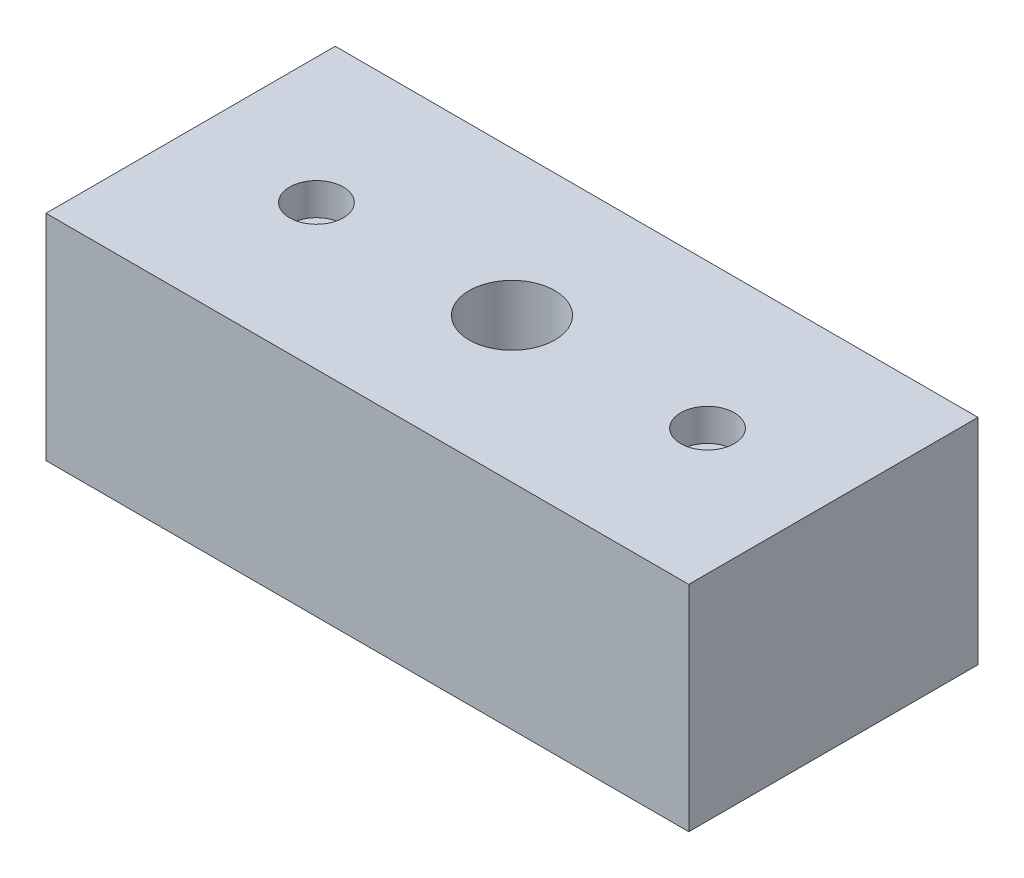
ISO-10303-21;
HEADER;
FILE_DESCRIPTION(('STEP AP214'),'2;1');
FILE_NAME('part.step','',(''),(''),'','','');
FILE_SCHEMA(('AUTOMOTIVE_DESIGN { 1 0 10303 214 1 1 1 1 }'));
ENDSEC;
DATA;
#1=APPLICATION_CONTEXT('core data for automotive mechanical design processes');
#2=APPLICATION_PROTOCOL_DEFINITION('international standard','automotive_design',2000,#1);
#3=PRODUCT_CONTEXT('',#1,'mechanical');
#4=PRODUCT('Part','Part','',(#3));
#5=PRODUCT_RELATED_PRODUCT_CATEGORY('part','',(#4));
#6=PRODUCT_DEFINITION_FORMATION('','',#4);
#7=PRODUCT_DEFINITION_CONTEXT('part definition',#1,'design');
#8=PRODUCT_DEFINITION('design','',#6,#7);
#9=PRODUCT_DEFINITION_SHAPE('','',#8);
#10=(LENGTH_UNIT() NAMED_UNIT(*) SI_UNIT(.MILLI.,.METRE.));
#11=(NAMED_UNIT(*) PLANE_ANGLE_UNIT() SI_UNIT($,.RADIAN.));
#12=(NAMED_UNIT(*) SI_UNIT($,.STERADIAN.) SOLID_ANGLE_UNIT());
#13=UNCERTAINTY_MEASURE_WITH_UNIT(LENGTH_MEASURE(1.E-05),#10,'distance_accuracy_value','');
#14=(GEOMETRIC_REPRESENTATION_CONTEXT(3) GLOBAL_UNCERTAINTY_ASSIGNED_CONTEXT((#13)) GLOBAL_UNIT_ASSIGNED_CONTEXT((#10,
#11,#12)) REPRESENTATION_CONTEXT('',''));
#15=CARTESIAN_POINT('',(0.,0.,0.));
#16=DIRECTION('',(0.,0.,1.));
#17=DIRECTION('',(1.,0.,0.));
#18=AXIS2_PLACEMENT_3D('',#15,#16,#17);
#19=CARTESIAN_POINT('',(30.,-10.,13.5));
#20=DIRECTION('',(-1.,0.,0.));
#21=DIRECTION('',(0.,0.,1.));
#22=AXIS2_PLACEMENT_3D('',#19,#20,#21);
#23=PLANE('',#22);
#24=DIRECTION('',(0.,1.,0.));
#25=VECTOR('',#24,1.);
#26=CARTESIAN_POINT('',(30.,-10.,-13.5));
#27=LINE('',#26,#25);
#28=CARTESIAN_POINT('',(30.,-10.,-13.5));
#29=VERTEX_POINT('',#28);
#30=CARTESIAN_POINT('',(30.,10.,-13.5));
#31=VERTEX_POINT('',#30);
#32=EDGE_CURVE('E106',#29,#31,#27,.T.);
#33=ORIENTED_EDGE('',*,*,#32,.T.);
#34=DIRECTION('',(0.,0.,-1.));
#35=VECTOR('',#34,1.);
#36=CARTESIAN_POINT('',(30.,10.,13.5));
#37=LINE('',#36,#35);
#38=CARTESIAN_POINT('',(30.,10.,13.5));
#39=VERTEX_POINT('',#38);
#40=EDGE_CURVE('E11',#39,#31,#37,.T.);
#41=ORIENTED_EDGE('',*,*,#40,.F.);
#42=DIRECTION('',(0.,1.,0.));
#43=VECTOR('',#42,1.);
#44=CARTESIAN_POINT('',(30.,-10.,13.5));
#45=LINE('',#44,#43);
#46=CARTESIAN_POINT('',(30.,-10.,13.5));
#47=VERTEX_POINT('',#46);
#48=EDGE_CURVE('E90',#47,#39,#45,.T.);
#49=ORIENTED_EDGE('',*,*,#48,.F.);
#50=DIRECTION('',(0.,0.,-1.));
#51=VECTOR('',#50,1.);
#52=CARTESIAN_POINT('',(30.,-10.,13.5));
#53=LINE('',#52,#51);
#54=EDGE_CURVE('E102',#47,#29,#53,.T.);
#55=ORIENTED_EDGE('',*,*,#54,.T.);
#56=EDGE_LOOP('',(#33,#41,#49,#55));
#57=FACE_BOUND('',#56,.T.);
#58=ADVANCED_FACE('F38',(#57),#23,.F.);
#59=CARTESIAN_POINT('',(-30.,10.,13.5));
#60=DIRECTION('',(0.,-1.,0.));
#61=DIRECTION('',(0.,0.,-1.));
#62=AXIS2_PLACEMENT_3D('',#59,#60,#61);
#63=PLANE('',#62);
#64=CARTESIAN_POINT('',(0.,10.,0.));
#65=DIRECTION('',(0.,1.,0.));
#66=DIRECTION('',(0.,0.,1.));
#67=AXIS2_PLACEMENT_3D('',#64,#65,#66);
#68=CIRCLE('',#67,4.);
#69=CARTESIAN_POINT('',(0.,10.,4.));
#70=VERTEX_POINT('',#69);
#71=EDGE_CURVE('E143',#70,#70,#68,.T.);
#72=ORIENTED_EDGE('',*,*,#71,.F.);
#73=EDGE_LOOP('',(#72));
#74=FACE_BOUND('',#73,.T.);
#75=CARTESIAN_POINT('',(-18.25,10.,0.));
#76=DIRECTION('',(0.,1.,0.));
#77=DIRECTION('',(0.,0.,1.));
#78=AXIS2_PLACEMENT_3D('',#75,#76,#77);
#79=CIRCLE('',#78,2.5);
#80=CARTESIAN_POINT('',(-18.25,10.,2.5));
#81=VERTEX_POINT('',#80);
#82=EDGE_CURVE('E136',#81,#81,#79,.T.);
#83=ORIENTED_EDGE('',*,*,#82,.F.);
#84=EDGE_LOOP('',(#83));
#85=FACE_BOUND('',#84,.T.);
#86=CARTESIAN_POINT('',(18.25,10.,0.));
#87=DIRECTION('',(0.,1.,0.));
#88=DIRECTION('',(0.,0.,-1.));
#89=AXIS2_PLACEMENT_3D('',#86,#87,#88);
#90=CIRCLE('',#89,2.5);
#91=CARTESIAN_POINT('',(18.25,10.,-2.5));
#92=VERTEX_POINT('',#91);
#93=EDGE_CURVE('E127',#92,#92,#90,.T.);
#94=ORIENTED_EDGE('',*,*,#93,.F.);
#95=EDGE_LOOP('',(#94));
#96=FACE_BOUND('',#95,.T.);
#97=DIRECTION('',(-1.,0.,0.));
#98=VECTOR('',#97,1.);
#99=CARTESIAN_POINT('',(-30.,10.,-13.5));
#100=LINE('',#99,#98);
#101=CARTESIAN_POINT('',(-30.,10.,-13.5));
#102=VERTEX_POINT('',#101);
#103=EDGE_CURVE('E95',#31,#102,#100,.T.);
#104=ORIENTED_EDGE('',*,*,#103,.T.);
#105=DIRECTION('',(0.,0.,-1.));
#106=VECTOR('',#105,1.);
#107=CARTESIAN_POINT('',(-30.,10.,13.5));
#108=LINE('',#107,#106);
#109=CARTESIAN_POINT('',(-30.,10.,13.5));
#110=VERTEX_POINT('',#109);
#111=EDGE_CURVE('E47',#110,#102,#108,.T.);
#112=ORIENTED_EDGE('',*,*,#111,.F.);
#113=DIRECTION('',(-1.,0.,0.));
#114=VECTOR('',#113,1.);
#115=CARTESIAN_POINT('',(-30.,10.,13.5));
#116=LINE('',#115,#114);
#117=EDGE_CURVE('E85',#39,#110,#116,.T.);
#118=ORIENTED_EDGE('',*,*,#117,.F.);
#119=ORIENTED_EDGE('',*,*,#40,.T.);
#120=EDGE_LOOP('',(#104,#112,#118,#119));
#121=FACE_BOUND('',#120,.T.);
#122=ADVANCED_FACE('F94',(#74,#85,#96,#121),#63,.F.);
#123=CARTESIAN_POINT('',(-30.,-10.,13.5));
#124=DIRECTION('',(1.,0.,0.));
#125=DIRECTION('',(0.,0.,-1.));
#126=AXIS2_PLACEMENT_3D('',#123,#124,#125);
#127=PLANE('',#126);
#128=DIRECTION('',(0.,-1.,0.));
#129=VECTOR('',#128,1.);
#130=CARTESIAN_POINT('',(-30.,-10.,-13.5));
#131=LINE('',#130,#129);
#132=CARTESIAN_POINT('',(-30.,-10.,-13.5));
#133=VERTEX_POINT('',#132);
#134=EDGE_CURVE('E72',#102,#133,#131,.T.);
#135=ORIENTED_EDGE('',*,*,#134,.T.);
#136=DIRECTION('',(0.,0.,-1.));
#137=VECTOR('',#136,1.);
#138=CARTESIAN_POINT('',(-30.,-10.,13.5));
#139=LINE('',#138,#137);
#140=CARTESIAN_POINT('',(-30.,-10.,13.5));
#141=VERTEX_POINT('',#140);
#142=EDGE_CURVE('E97',#141,#133,#139,.T.);
#143=ORIENTED_EDGE('',*,*,#142,.F.);
#144=DIRECTION('',(0.,-1.,0.));
#145=VECTOR('',#144,1.);
#146=CARTESIAN_POINT('',(-30.,-10.,13.5));
#147=LINE('',#146,#145);
#148=EDGE_CURVE('E88',#110,#141,#147,.T.);
#149=ORIENTED_EDGE('',*,*,#148,.F.);
#150=ORIENTED_EDGE('',*,*,#111,.T.);
#151=EDGE_LOOP('',(#135,#143,#149,#150));
#152=FACE_BOUND('',#151,.T.);
#153=ADVANCED_FACE('F98',(#152),#127,.F.);
#154=CARTESIAN_POINT('',(-30.,-10.,13.5));
#155=DIRECTION('',(0.,1.,0.));
#156=DIRECTION('',(0.,0.,1.));
#157=AXIS2_PLACEMENT_3D('',#154,#155,#156);
#158=PLANE('',#157);
#159=CARTESIAN_POINT('',(0.,-10.,0.));
#160=DIRECTION('',(0.,1.,0.));
#161=DIRECTION('',(0.,0.,1.));
#162=AXIS2_PLACEMENT_3D('',#159,#160,#161);
#163=CIRCLE('',#162,4.);
#164=CARTESIAN_POINT('',(0.,-10.,4.));
#165=VERTEX_POINT('',#164);
#166=EDGE_CURVE('E132',#165,#165,#163,.T.);
#167=ORIENTED_EDGE('',*,*,#166,.T.);
#168=EDGE_LOOP('',(#167));
#169=FACE_BOUND('',#168,.T.);
#170=DIRECTION('',(1.,0.,0.));
#171=VECTOR('',#170,1.);
#172=CARTESIAN_POINT('',(-30.,-10.,-13.5));
#173=LINE('',#172,#171);
#174=EDGE_CURVE('E78',#133,#29,#173,.T.);
#175=ORIENTED_EDGE('',*,*,#174,.T.);
#176=ORIENTED_EDGE('',*,*,#54,.F.);
#177=DIRECTION('',(1.,0.,0.));
#178=VECTOR('',#177,1.);
#179=CARTESIAN_POINT('',(-30.,-10.,13.5));
#180=LINE('',#179,#178);
#181=EDGE_CURVE('E55',#141,#47,#180,.T.);
#182=ORIENTED_EDGE('',*,*,#181,.F.);
#183=ORIENTED_EDGE('',*,*,#142,.T.);
#184=EDGE_LOOP('',(#175,#176,#182,#183));
#185=FACE_BOUND('',#184,.T.);
#186=ADVANCED_FACE('F120',(#169,#185),#158,.F.);
#187=CARTESIAN_POINT('',(0.,0.,13.5));
#188=DIRECTION('',(0.,0.,-1.));
#189=DIRECTION('',(-1.,0.,0.));
#190=AXIS2_PLACEMENT_3D('',#187,#188,#189);
#191=PLANE('',#190);
#192=ORIENTED_EDGE('',*,*,#48,.T.);
#193=ORIENTED_EDGE('',*,*,#117,.T.);
#194=ORIENTED_EDGE('',*,*,#148,.T.);
#195=ORIENTED_EDGE('',*,*,#181,.T.);
#196=EDGE_LOOP('',(#192,#193,#194,#195));
#197=FACE_BOUND('',#196,.T.);
#198=ADVANCED_FACE('F86',(#197),#191,.F.);
#199=CARTESIAN_POINT('',(0.,0.,-13.5));
#200=DIRECTION('',(0.,0.,-1.));
#201=DIRECTION('',(-1.,0.,0.));
#202=AXIS2_PLACEMENT_3D('',#199,#200,#201);
#203=PLANE('',#202);
#204=ORIENTED_EDGE('',*,*,#32,.F.);
#205=ORIENTED_EDGE('',*,*,#174,.F.);
#206=ORIENTED_EDGE('',*,*,#134,.F.);
#207=ORIENTED_EDGE('',*,*,#103,.F.);
#208=EDGE_LOOP('',(#204,#205,#206,#207));
#209=FACE_BOUND('',#208,.T.);
#210=ADVANCED_FACE('F123',(#209),#203,.T.);
#211=CARTESIAN_POINT('',(18.25,7.,0.));
#212=DIRECTION('',(0.,1.,0.));
#213=DIRECTION('',(0.,0.,1.));
#214=AXIS2_PLACEMENT_3D('',#211,#212,#213);
#215=CYLINDRICAL_SURFACE('',#214,2.5);
#216=CARTESIAN_POINT('',(18.25,7.,0.));
#217=DIRECTION('',(0.,1.,0.));
#218=DIRECTION('',(0.,0.,-1.));
#219=AXIS2_PLACEMENT_3D('',#216,#217,#218);
#220=CIRCLE('',#219,2.5);
#221=CARTESIAN_POINT('',(18.25,7.,-2.5));
#222=VERTEX_POINT('',#221);
#223=EDGE_CURVE('E131',#222,#222,#220,.T.);
#224=ORIENTED_EDGE('',*,*,#223,.F.);
#225=EDGE_LOOP('',(#224));
#226=FACE_BOUND('',#225,.T.);
#227=ORIENTED_EDGE('',*,*,#93,.T.);
#228=EDGE_LOOP('',(#227));
#229=FACE_BOUND('',#228,.T.);
#230=ADVANCED_FACE('F165',(#226,#229),#215,.F.);
#231=CARTESIAN_POINT('',(18.25,7.,0.));
#232=DIRECTION('',(0.,-1.,0.));
#233=DIRECTION('',(0.,0.,-1.));
#234=AXIS2_PLACEMENT_3D('',#231,#232,#233);
#235=PLANE('',#234);
#236=ORIENTED_EDGE('',*,*,#223,.T.);
#237=EDGE_LOOP('',(#236));
#238=FACE_BOUND('',#237,.T.);
#239=ADVANCED_FACE('F167',(#238),#235,.F.);
#240=CARTESIAN_POINT('',(-18.25,7.,0.));
#241=DIRECTION('',(0.,1.,0.));
#242=DIRECTION('',(0.,0.,1.));
#243=AXIS2_PLACEMENT_3D('',#240,#241,#242);
#244=CYLINDRICAL_SURFACE('',#243,2.5);
#245=CARTESIAN_POINT('',(-18.25,7.,0.));
#246=DIRECTION('',(0.,1.,0.));
#247=DIRECTION('',(0.,0.,1.));
#248=AXIS2_PLACEMENT_3D('',#245,#246,#247);
#249=CIRCLE('',#248,2.5);
#250=CARTESIAN_POINT('',(-18.25,7.,2.5));
#251=VERTEX_POINT('',#250);
#252=EDGE_CURVE('E110',#251,#251,#249,.T.);
#253=ORIENTED_EDGE('',*,*,#252,.F.);
#254=EDGE_LOOP('',(#253));
#255=FACE_BOUND('',#254,.T.);
#256=ORIENTED_EDGE('',*,*,#82,.T.);
#257=EDGE_LOOP('',(#256));
#258=FACE_BOUND('',#257,.T.);
#259=ADVANCED_FACE('F174',(#255,#258),#244,.F.);
#260=CARTESIAN_POINT('',(-18.25,7.,0.));
#261=DIRECTION('',(0.,1.,0.));
#262=DIRECTION('',(0.,0.,1.));
#263=AXIS2_PLACEMENT_3D('',#260,#261,#262);
#264=PLANE('',#263);
#265=ORIENTED_EDGE('',*,*,#252,.T.);
#266=EDGE_LOOP('',(#265));
#267=FACE_BOUND('',#266,.T.);
#268=ADVANCED_FACE('F155',(#267),#264,.T.);
#269=CARTESIAN_POINT('',(0.,-10.,0.));
#270=DIRECTION('',(0.,1.,0.));
#271=DIRECTION('',(0.,0.,1.));
#272=AXIS2_PLACEMENT_3D('',#269,#270,#271);
#273=CYLINDRICAL_SURFACE('',#272,4.);
#274=ORIENTED_EDGE('',*,*,#166,.F.);
#275=EDGE_LOOP('',(#274));
#276=FACE_BOUND('',#275,.T.);
#277=ORIENTED_EDGE('',*,*,#71,.T.);
#278=EDGE_LOOP('',(#277));
#279=FACE_BOUND('',#278,.T.);
#280=ADVANCED_FACE('F152',(#276,#279),#273,.F.);
#281=CLOSED_SHELL('',(#58,#122,#153,#186,#198,#210,#230,#239,#259,#268,#280));
#282=MANIFOLD_SOLID_BREP('B2',#281);
#283=ADVANCED_BREP_SHAPE_REPRESENTATION('',(#18,#282),#14);
#284=SHAPE_DEFINITION_REPRESENTATION(#9,#283);
ENDSEC;
END-ISO-10303-21;
